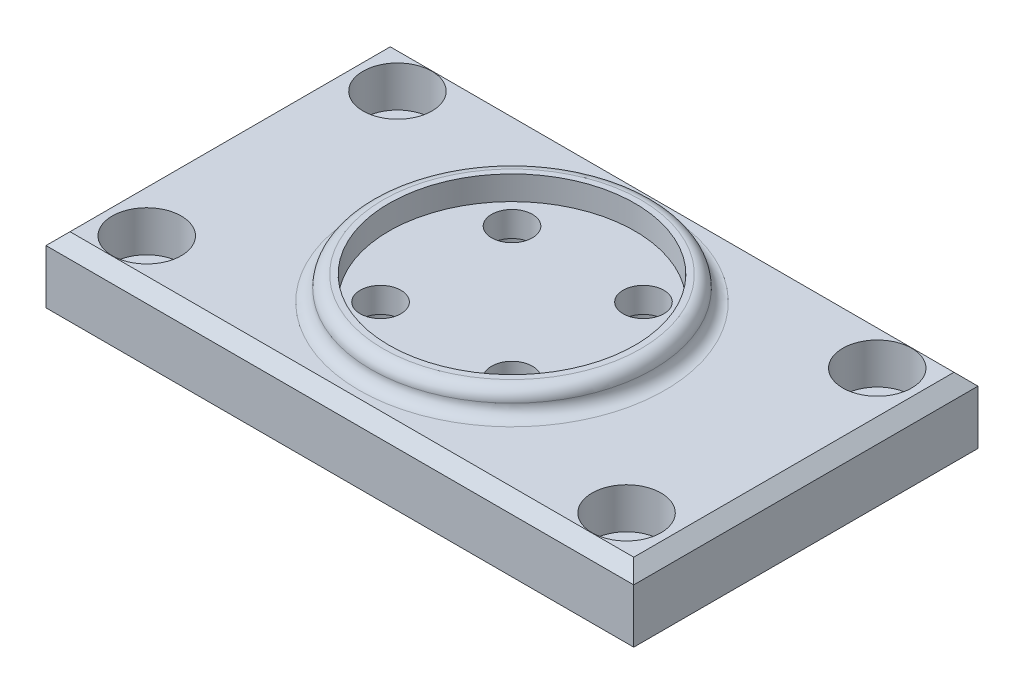
ISO-10303-21;
HEADER;
FILE_DESCRIPTION(('STEP AP214'),'2;1');
FILE_NAME('part.step','',(''),(''),'','','');
FILE_SCHEMA(('AUTOMOTIVE_DESIGN { 1 0 10303 214 1 1 1 1 }'));
ENDSEC;
DATA;
#1=APPLICATION_CONTEXT('core data for automotive mechanical design processes');
#2=APPLICATION_PROTOCOL_DEFINITION('international standard','automotive_design',2000,#1);
#3=PRODUCT_CONTEXT('',#1,'mechanical');
#4=PRODUCT('Part','Part','',(#3));
#5=PRODUCT_RELATED_PRODUCT_CATEGORY('part','',(#4));
#6=PRODUCT_DEFINITION_FORMATION('','',#4);
#7=PRODUCT_DEFINITION_CONTEXT('part definition',#1,'design');
#8=PRODUCT_DEFINITION('design','',#6,#7);
#9=PRODUCT_DEFINITION_SHAPE('','',#8);
#10=(LENGTH_UNIT() NAMED_UNIT(*) SI_UNIT(.MILLI.,.METRE.));
#11=(NAMED_UNIT(*) PLANE_ANGLE_UNIT() SI_UNIT($,.RADIAN.));
#12=(NAMED_UNIT(*) SI_UNIT($,.STERADIAN.) SOLID_ANGLE_UNIT());
#13=UNCERTAINTY_MEASURE_WITH_UNIT(LENGTH_MEASURE(1.E-05),#10,'distance_accuracy_value','');
#14=(GEOMETRIC_REPRESENTATION_CONTEXT(3) GLOBAL_UNCERTAINTY_ASSIGNED_CONTEXT((#13)) GLOBAL_UNIT_ASSIGNED_CONTEXT((#10,
#11,#12)) REPRESENTATION_CONTEXT('',''));
#15=CARTESIAN_POINT('',(0.,0.,0.));
#16=DIRECTION('',(0.,0.,1.));
#17=DIRECTION('',(1.,0.,0.));
#18=AXIS2_PLACEMENT_3D('',#15,#16,#17);
#19=CARTESIAN_POINT('',(0.,5.5,0.));
#20=DIRECTION('',(0.,1.,0.));
#21=DIRECTION('',(0.,0.,1.));
#22=AXIS2_PLACEMENT_3D('',#19,#20,#21);
#23=PLANE('',#22);
#24=CARTESIAN_POINT('',(5.48007755419574,5.5,-5.48007755419574));
#25=DIRECTION('',(0.,-1.,0.));
#26=DIRECTION('',(0.,0.,-1.));
#27=AXIS2_PLACEMENT_3D('',#24,#25,#26);
#28=CIRCLE('',#27,1.7);
#29=CARTESIAN_POINT('',(5.48007755419574,5.5,-7.18007755419574));
#30=VERTEX_POINT('',#29);
#31=EDGE_CURVE('E612',#30,#30,#28,.T.);
#32=ORIENTED_EDGE('',*,*,#31,.T.);
#33=EDGE_LOOP('',(#32));
#34=FACE_BOUND('',#33,.T.);
#35=CARTESIAN_POINT('',(-5.48007755419574,5.5,5.48007755419574));
#36=DIRECTION('',(0.,-1.,0.));
#37=DIRECTION('',(0.,0.,-1.));
#38=AXIS2_PLACEMENT_3D('',#35,#36,#37);
#39=CIRCLE('',#38,1.7);
#40=CARTESIAN_POINT('',(-5.48007755419574,5.5,3.78007755419574));
#41=VERTEX_POINT('',#40);
#42=EDGE_CURVE('E623',#41,#41,#39,.T.);
#43=ORIENTED_EDGE('',*,*,#42,.T.);
#44=EDGE_LOOP('',(#43));
#45=FACE_BOUND('',#44,.T.);
#46=CARTESIAN_POINT('',(-5.48007755419574,5.5,-5.48007755419575));
#47=DIRECTION('',(0.,-1.,0.));
#48=DIRECTION('',(0.,0.,-1.));
#49=AXIS2_PLACEMENT_3D('',#46,#47,#48);
#50=CIRCLE('',#49,1.7);
#51=CARTESIAN_POINT('',(-5.48007755419574,5.5,-7.18007755419575));
#52=VERTEX_POINT('',#51);
#53=EDGE_CURVE('E635',#52,#52,#50,.T.);
#54=ORIENTED_EDGE('',*,*,#53,.T.);
#55=EDGE_LOOP('',(#54));
#56=FACE_BOUND('',#55,.T.);
#57=CARTESIAN_POINT('',(5.48007755419574,5.5,5.48007755419574));
#58=DIRECTION('',(0.,-1.,0.));
#59=DIRECTION('',(0.,0.,-1.));
#60=AXIS2_PLACEMENT_3D('',#57,#58,#59);
#61=CIRCLE('',#60,1.7);
#62=CARTESIAN_POINT('',(5.48007755419574,5.5,3.78007755419575));
#63=VERTEX_POINT('',#62);
#64=EDGE_CURVE('E647',#63,#63,#61,.T.);
#65=ORIENTED_EDGE('',*,*,#64,.T.);
#66=EDGE_LOOP('',(#65));
#67=FACE_BOUND('',#66,.T.);
#68=CARTESIAN_POINT('',(0.,5.5,0.));
#69=DIRECTION('',(0.,1.,0.));
#70=DIRECTION('',(0.,0.,1.));
#71=AXIS2_PLACEMENT_3D('',#68,#69,#70);
#72=CIRCLE('',#71,10.25);
#73=CARTESIAN_POINT('',(0.,5.5,10.25));
#74=VERTEX_POINT('',#73);
#75=EDGE_CURVE('E137',#74,#74,#72,.T.);
#76=ORIENTED_EDGE('',*,*,#75,.T.);
#77=EDGE_LOOP('',(#76));
#78=FACE_BOUND('',#77,.T.);
#79=ADVANCED_FACE('F41',(#34,#45,#56,#67,#78),#23,.T.);
#80=CARTESIAN_POINT('',(0.,0.,0.));
#81=DIRECTION('',(0.,1.,0.));
#82=DIRECTION('',(0.,0.,1.));
#83=AXIS2_PLACEMENT_3D('',#80,#81,#82);
#84=PLANE('',#83);
#85=CARTESIAN_POINT('',(5.48007755419574,0.,5.48007755419574));
#86=DIRECTION('',(0.,-1.,0.));
#87=DIRECTION('',(0.,0.,-1.));
#88=AXIS2_PLACEMENT_3D('',#85,#86,#87);
#89=CIRCLE('',#88,2.87499999999999);
#90=CARTESIAN_POINT('',(5.48007755419574,0.,2.60507755419575));
#91=VERTEX_POINT('',#90);
#92=EDGE_CURVE('E656',#91,#91,#89,.T.);
#93=ORIENTED_EDGE('',*,*,#92,.F.);
#94=EDGE_LOOP('',(#93));
#95=FACE_BOUND('',#94,.T.);
#96=CARTESIAN_POINT('',(-5.48007755419574,0.,-5.48007755419575));
#97=DIRECTION('',(0.,-1.,0.));
#98=DIRECTION('',(0.,0.,-1.));
#99=AXIS2_PLACEMENT_3D('',#96,#97,#98);
#100=CIRCLE('',#99,2.875);
#101=CARTESIAN_POINT('',(-5.48007755419574,0.,-8.35507755419574));
#102=VERTEX_POINT('',#101);
#103=EDGE_CURVE('E644',#102,#102,#100,.T.);
#104=ORIENTED_EDGE('',*,*,#103,.F.);
#105=EDGE_LOOP('',(#104));
#106=FACE_BOUND('',#105,.T.);
#107=CARTESIAN_POINT('',(-5.48007755419574,0.,5.48007755419574));
#108=DIRECTION('',(0.,-1.,0.));
#109=DIRECTION('',(0.,0.,-1.));
#110=AXIS2_PLACEMENT_3D('',#107,#108,#109);
#111=CIRCLE('',#110,2.875);
#112=CARTESIAN_POINT('',(-5.48007755419574,0.,2.60507755419575));
#113=VERTEX_POINT('',#112);
#114=EDGE_CURVE('E632',#113,#113,#111,.T.);
#115=ORIENTED_EDGE('',*,*,#114,.F.);
#116=EDGE_LOOP('',(#115));
#117=FACE_BOUND('',#116,.T.);
#118=CARTESIAN_POINT('',(-20.,0.,-10.45));
#119=DIRECTION('',(0.,1.,0.));
#120=DIRECTION('',(0.,0.,1.));
#121=AXIS2_PLACEMENT_3D('',#118,#119,#120);
#122=CIRCLE('',#121,1.7);
#123=CARTESIAN_POINT('',(-20.,0.,-8.75));
#124=VERTEX_POINT('',#123);
#125=EDGE_CURVE('E602',#124,#124,#122,.T.);
#126=ORIENTED_EDGE('',*,*,#125,.T.);
#127=EDGE_LOOP('',(#126));
#128=FACE_BOUND('',#127,.T.);
#129=CARTESIAN_POINT('',(20.,0.,10.45));
#130=DIRECTION('',(0.,1.,0.));
#131=DIRECTION('',(0.,0.,1.));
#132=AXIS2_PLACEMENT_3D('',#129,#130,#131);
#133=CIRCLE('',#132,1.7);
#134=CARTESIAN_POINT('',(20.,0.,12.15));
#135=VERTEX_POINT('',#134);
#136=EDGE_CURVE('E590',#135,#135,#133,.T.);
#137=ORIENTED_EDGE('',*,*,#136,.T.);
#138=EDGE_LOOP('',(#137));
#139=FACE_BOUND('',#138,.T.);
#140=CARTESIAN_POINT('',(20.,0.,-10.45));
#141=DIRECTION('',(0.,1.,0.));
#142=DIRECTION('',(0.,0.,1.));
#143=AXIS2_PLACEMENT_3D('',#140,#141,#142);
#144=CIRCLE('',#143,1.7);
#145=CARTESIAN_POINT('',(20.,0.,-8.75));
#146=VERTEX_POINT('',#145);
#147=EDGE_CURVE('E205',#146,#146,#144,.T.);
#148=ORIENTED_EDGE('',*,*,#147,.T.);
#149=EDGE_LOOP('',(#148));
#150=FACE_BOUND('',#149,.T.);
#151=CARTESIAN_POINT('',(-20.,0.,10.45));
#152=DIRECTION('',(0.,1.,0.));
#153=DIRECTION('',(0.,0.,1.));
#154=AXIS2_PLACEMENT_3D('',#151,#152,#153);
#155=CIRCLE('',#154,1.7);
#156=CARTESIAN_POINT('',(-20.,0.,12.15));
#157=VERTEX_POINT('',#156);
#158=EDGE_CURVE('E114',#157,#157,#155,.T.);
#159=ORIENTED_EDGE('',*,*,#158,.T.);
#160=EDGE_LOOP('',(#159));
#161=FACE_BOUND('',#160,.T.);
#162=DIRECTION('',(0.,0.,1.));
#163=VECTOR('',#162,1.);
#164=CARTESIAN_POINT('',(-24.5,0.,14.35));
#165=LINE('',#164,#163);
#166=CARTESIAN_POINT('',(-24.5,0.,-14.35));
#167=VERTEX_POINT('',#166);
#168=CARTESIAN_POINT('',(-24.5,0.,14.35));
#169=VERTEX_POINT('',#168);
#170=EDGE_CURVE('E107',#167,#169,#165,.T.);
#171=ORIENTED_EDGE('',*,*,#170,.F.);
#172=DIRECTION('',(-1.,0.,0.));
#173=VECTOR('',#172,1.);
#174=CARTESIAN_POINT('',(24.5,0.,-14.35));
#175=LINE('',#174,#173);
#176=CARTESIAN_POINT('',(24.5,0.,-14.35));
#177=VERTEX_POINT('',#176);
#178=EDGE_CURVE('E122',#177,#167,#175,.T.);
#179=ORIENTED_EDGE('',*,*,#178,.F.);
#180=DIRECTION('',(0.,0.,-1.));
#181=VECTOR('',#180,1.);
#182=CARTESIAN_POINT('',(24.5,0.,14.35));
#183=LINE('',#182,#181);
#184=CARTESIAN_POINT('',(24.5,0.,14.35));
#185=VERTEX_POINT('',#184);
#186=EDGE_CURVE('E109',#185,#177,#183,.T.);
#187=ORIENTED_EDGE('',*,*,#186,.F.);
#188=DIRECTION('',(1.,0.,0.));
#189=VECTOR('',#188,1.);
#190=CARTESIAN_POINT('',(24.5,0.,14.35));
#191=LINE('',#190,#189);
#192=EDGE_CURVE('E96',#169,#185,#191,.T.);
#193=ORIENTED_EDGE('',*,*,#192,.F.);
#194=EDGE_LOOP('',(#171,#179,#187,#193));
#195=FACE_BOUND('',#194,.T.);
#196=CARTESIAN_POINT('',(5.48007755419574,0.,-5.48007755419574));
#197=DIRECTION('',(0.,-1.,0.));
#198=DIRECTION('',(0.,0.,-1.));
#199=AXIS2_PLACEMENT_3D('',#196,#197,#198);
#200=CIRCLE('',#199,2.875);
#201=CARTESIAN_POINT('',(5.48007755419574,0.,-8.35507755419574));
#202=VERTEX_POINT('',#201);
#203=EDGE_CURVE('E620',#202,#202,#200,.T.);
#204=ORIENTED_EDGE('',*,*,#203,.F.);
#205=EDGE_LOOP('',(#204));
#206=FACE_BOUND('',#205,.T.);
#207=ADVANCED_FACE('F104',(#95,#106,#117,#128,#139,#150,#161,#195,#206),#84,.F.);
#208=CARTESIAN_POINT('',(-24.5,5.5,14.35));
#209=DIRECTION('',(1.,0.,0.));
#210=DIRECTION('',(0.,0.,-1.));
#211=AXIS2_PLACEMENT_3D('',#208,#209,#210);
#212=PLANE('',#211);
#213=DIRECTION('',(0.,-1.,0.));
#214=VECTOR('',#213,1.);
#215=CARTESIAN_POINT('',(-24.5,5.5,14.35));
#216=LINE('',#215,#214);
#217=CARTESIAN_POINT('',(-24.5,4.49999999999999,14.35));
#218=VERTEX_POINT('',#217);
#219=EDGE_CURVE('E93',#218,#169,#216,.T.);
#220=ORIENTED_EDGE('',*,*,#219,.F.);
#221=DIRECTION('',(0.,0.,-1.));
#222=VECTOR('',#221,1.);
#223=CARTESIAN_POINT('',(-24.5,4.49999999999999,-14.35));
#224=LINE('',#223,#222);
#225=CARTESIAN_POINT('',(-24.5,4.49999999999999,-14.35));
#226=VERTEX_POINT('',#225);
#227=EDGE_CURVE('E51',#218,#226,#224,.T.);
#228=ORIENTED_EDGE('',*,*,#227,.T.);
#229=DIRECTION('',(0.,-1.,0.));
#230=VECTOR('',#229,1.);
#231=CARTESIAN_POINT('',(-24.5,5.5,-14.35));
#232=LINE('',#231,#230);
#233=EDGE_CURVE('E112',#226,#167,#232,.T.);
#234=ORIENTED_EDGE('',*,*,#233,.T.);
#235=ORIENTED_EDGE('',*,*,#170,.T.);
#236=EDGE_LOOP('',(#220,#228,#234,#235));
#237=FACE_BOUND('',#236,.T.);
#238=ADVANCED_FACE('F111',(#237),#212,.F.);
#239=CARTESIAN_POINT('',(24.5,5.5,14.35));
#240=DIRECTION('',(0.,0.,-1.));
#241=DIRECTION('',(-1.,0.,0.));
#242=AXIS2_PLACEMENT_3D('',#239,#240,#241);
#243=PLANE('',#242);
#244=DIRECTION('',(0.,-1.,0.));
#245=VECTOR('',#244,1.);
#246=CARTESIAN_POINT('',(24.5,5.5,14.35));
#247=LINE('',#246,#245);
#248=CARTESIAN_POINT('',(24.5,4.49999999999999,14.35));
#249=VERTEX_POINT('',#248);
#250=EDGE_CURVE('E100',#249,#185,#247,.T.);
#251=ORIENTED_EDGE('',*,*,#250,.F.);
#252=DIRECTION('',(-1.,0.,0.));
#253=VECTOR('',#252,1.);
#254=CARTESIAN_POINT('',(-24.5,4.49999999999999,14.35));
#255=LINE('',#254,#253);
#256=EDGE_CURVE('E11',#249,#218,#255,.T.);
#257=ORIENTED_EDGE('',*,*,#256,.T.);
#258=ORIENTED_EDGE('',*,*,#219,.T.);
#259=ORIENTED_EDGE('',*,*,#192,.T.);
#260=EDGE_LOOP('',(#251,#257,#258,#259));
#261=FACE_BOUND('',#260,.T.);
#262=ADVANCED_FACE('F95',(#261),#243,.F.);
#263=CARTESIAN_POINT('',(24.5,5.5,14.35));
#264=DIRECTION('',(-1.,0.,0.));
#265=DIRECTION('',(0.,0.,1.));
#266=AXIS2_PLACEMENT_3D('',#263,#264,#265);
#267=PLANE('',#266);
#268=DIRECTION('',(0.,-1.,0.));
#269=VECTOR('',#268,1.);
#270=CARTESIAN_POINT('',(24.5,5.5,-14.35));
#271=LINE('',#270,#269);
#272=CARTESIAN_POINT('',(24.5,4.49999999999999,-14.35));
#273=VERTEX_POINT('',#272);
#274=EDGE_CURVE('E125',#273,#177,#271,.T.);
#275=ORIENTED_EDGE('',*,*,#274,.F.);
#276=DIRECTION('',(0.,0.,1.));
#277=VECTOR('',#276,1.);
#278=CARTESIAN_POINT('',(24.5,4.49999999999999,14.35));
#279=LINE('',#278,#277);
#280=EDGE_CURVE('E146',#273,#249,#279,.T.);
#281=ORIENTED_EDGE('',*,*,#280,.T.);
#282=ORIENTED_EDGE('',*,*,#250,.T.);
#283=ORIENTED_EDGE('',*,*,#186,.T.);
#284=EDGE_LOOP('',(#275,#281,#282,#283));
#285=FACE_BOUND('',#284,.T.);
#286=ADVANCED_FACE('F176',(#285),#267,.F.);
#287=CARTESIAN_POINT('',(24.5,5.5,-14.35));
#288=DIRECTION('',(0.,0.,1.));
#289=DIRECTION('',(1.,0.,0.));
#290=AXIS2_PLACEMENT_3D('',#287,#288,#289);
#291=PLANE('',#290);
#292=ORIENTED_EDGE('',*,*,#233,.F.);
#293=DIRECTION('',(1.,0.,0.));
#294=VECTOR('',#293,1.);
#295=CARTESIAN_POINT('',(24.5,4.49999999999999,-14.35));
#296=LINE('',#295,#294);
#297=EDGE_CURVE('E149',#226,#273,#296,.T.);
#298=ORIENTED_EDGE('',*,*,#297,.T.);
#299=ORIENTED_EDGE('',*,*,#274,.T.);
#300=ORIENTED_EDGE('',*,*,#178,.T.);
#301=EDGE_LOOP('',(#292,#298,#299,#300));
#302=FACE_BOUND('',#301,.T.);
#303=ADVANCED_FACE('F173',(#302),#291,.F.);
#304=DIRECTION('',(1.,0.,0.));
#305=VECTOR('',#304,1.);
#306=CARTESIAN_POINT('',(24.5,5.5,13.35));
#307=LINE('',#306,#305);
#308=CARTESIAN_POINT('',(-23.5,5.5,13.35));
#309=VERTEX_POINT('',#308);
#310=CARTESIAN_POINT('',(23.5,5.5,13.35));
#311=VERTEX_POINT('',#310);
#312=EDGE_CURVE('E133',#309,#311,#307,.T.);
#313=ORIENTED_EDGE('',*,*,#312,.T.);
#314=DIRECTION('',(0.,0.,-1.));
#315=VECTOR('',#314,1.);
#316=CARTESIAN_POINT('',(23.5,5.5,-14.35));
#317=LINE('',#316,#315);
#318=CARTESIAN_POINT('',(23.5,5.5,-13.35));
#319=VERTEX_POINT('',#318);
#320=EDGE_CURVE('E143',#311,#319,#317,.T.);
#321=ORIENTED_EDGE('',*,*,#320,.T.);
#322=DIRECTION('',(-1.,0.,0.));
#323=VECTOR('',#322,1.);
#324=CARTESIAN_POINT('',(-24.5,5.5,-13.35));
#325=LINE('',#324,#323);
#326=CARTESIAN_POINT('',(-23.5,5.5,-13.35));
#327=VERTEX_POINT('',#326);
#328=EDGE_CURVE('E141',#319,#327,#325,.T.);
#329=ORIENTED_EDGE('',*,*,#328,.T.);
#330=DIRECTION('',(0.,0.,1.));
#331=VECTOR('',#330,1.);
#332=CARTESIAN_POINT('',(-23.5,5.5,14.35));
#333=LINE('',#332,#331);
#334=EDGE_CURVE('E139',#327,#309,#333,.T.);
#335=ORIENTED_EDGE('',*,*,#334,.T.);
#336=EDGE_LOOP('',(#313,#321,#329,#335));
#337=FACE_BOUND('',#336,.T.);
#338=CARTESIAN_POINT('',(0.,5.5,0.));
#339=DIRECTION('',(0.,1.,0.));
#340=DIRECTION('',(0.,0.,1.));
#341=AXIS2_PLACEMENT_3D('',#338,#339,#340);
#342=CIRCLE('',#341,12.75);
#343=CARTESIAN_POINT('',(0.,5.5,12.75));
#344=VERTEX_POINT('',#343);
#345=EDGE_CURVE('E130',#344,#344,#342,.F.);
#346=ORIENTED_EDGE('',*,*,#345,.T.);
#347=EDGE_LOOP('',(#346));
#348=FACE_BOUND('',#347,.T.);
#349=CARTESIAN_POINT('',(-20.,5.5,-10.45));
#350=DIRECTION('',(0.,1.,0.));
#351=DIRECTION('',(0.,0.,1.));
#352=AXIS2_PLACEMENT_3D('',#349,#350,#351);
#353=CIRCLE('',#352,2.875);
#354=CARTESIAN_POINT('',(-20.,5.5,-7.575));
#355=VERTEX_POINT('',#354);
#356=EDGE_CURVE('E191',#355,#355,#353,.T.);
#357=ORIENTED_EDGE('',*,*,#356,.F.);
#358=EDGE_LOOP('',(#357));
#359=FACE_BOUND('',#358,.T.);
#360=CARTESIAN_POINT('',(20.,5.5,10.45));
#361=DIRECTION('',(0.,1.,0.));
#362=DIRECTION('',(0.,0.,1.));
#363=AXIS2_PLACEMENT_3D('',#360,#361,#362);
#364=CIRCLE('',#363,2.875);
#365=CARTESIAN_POINT('',(20.,5.5,13.325));
#366=VERTEX_POINT('',#365);
#367=EDGE_CURVE('E195',#366,#366,#364,.T.);
#368=ORIENTED_EDGE('',*,*,#367,.F.);
#369=EDGE_LOOP('',(#368));
#370=FACE_BOUND('',#369,.T.);
#371=CARTESIAN_POINT('',(20.,5.5,-10.45));
#372=DIRECTION('',(0.,1.,0.));
#373=DIRECTION('',(0.,0.,1.));
#374=AXIS2_PLACEMENT_3D('',#371,#372,#373);
#375=CIRCLE('',#374,2.875);
#376=CARTESIAN_POINT('',(20.,5.5,-7.575));
#377=VERTEX_POINT('',#376);
#378=EDGE_CURVE('E199',#377,#377,#375,.T.);
#379=ORIENTED_EDGE('',*,*,#378,.F.);
#380=EDGE_LOOP('',(#379));
#381=FACE_BOUND('',#380,.T.);
#382=CARTESIAN_POINT('',(-20.,5.5,10.45));
#383=DIRECTION('',(0.,1.,0.));
#384=DIRECTION('',(0.,0.,1.));
#385=AXIS2_PLACEMENT_3D('',#382,#383,#384);
#386=CIRCLE('',#385,2.875);
#387=CARTESIAN_POINT('',(-20.,5.5,13.325));
#388=VERTEX_POINT('',#387);
#389=EDGE_CURVE('E202',#388,#388,#386,.T.);
#390=ORIENTED_EDGE('',*,*,#389,.F.);
#391=EDGE_LOOP('',(#390));
#392=FACE_BOUND('',#391,.T.);
#393=ADVANCED_FACE('F181',(#337,#348,#359,#370,#381,#392),#23,.T.);
#394=CARTESIAN_POINT('',(-20.,5.5,10.45));
#395=DIRECTION('',(0.,1.,0.));
#396=DIRECTION('',(0.,0.,1.));
#397=AXIS2_PLACEMENT_3D('',#394,#395,#396);
#398=CYLINDRICAL_SURFACE('',#397,1.7);
#399=ORIENTED_EDGE('',*,*,#158,.F.);
#400=EDGE_LOOP('',(#399));
#401=FACE_BOUND('',#400,.T.);
#402=CARTESIAN_POINT('',(-20.,2.1,10.45));
#403=DIRECTION('',(0.,1.,0.));
#404=DIRECTION('',(0.,0.,1.));
#405=AXIS2_PLACEMENT_3D('',#402,#403,#404);
#406=CIRCLE('',#405,1.7);
#407=CARTESIAN_POINT('',(-20.,2.1,12.15));
#408=VERTEX_POINT('',#407);
#409=EDGE_CURVE('E117',#408,#408,#406,.T.);
#410=ORIENTED_EDGE('',*,*,#409,.T.);
#411=EDGE_LOOP('',(#410));
#412=FACE_BOUND('',#411,.T.);
#413=ADVANCED_FACE('F184',(#401,#412),#398,.F.);
#414=CARTESIAN_POINT('',(-18.3,2.1,10.45));
#415=DIRECTION('',(0.,-1.,0.));
#416=DIRECTION('',(0.,0.,-1.));
#417=AXIS2_PLACEMENT_3D('',#414,#415,#416);
#418=PLANE('',#417);
#419=ORIENTED_EDGE('',*,*,#409,.F.);
#420=EDGE_LOOP('',(#419));
#421=FACE_BOUND('',#420,.T.);
#422=CARTESIAN_POINT('',(-20.,2.1,10.45));
#423=DIRECTION('',(0.,1.,0.));
#424=DIRECTION('',(0.,0.,1.));
#425=AXIS2_PLACEMENT_3D('',#422,#423,#424);
#426=CIRCLE('',#425,2.875);
#427=CARTESIAN_POINT('',(-20.,2.1,13.325));
#428=VERTEX_POINT('',#427);
#429=EDGE_CURVE('E204',#428,#428,#426,.T.);
#430=ORIENTED_EDGE('',*,*,#429,.T.);
#431=EDGE_LOOP('',(#430));
#432=FACE_BOUND('',#431,.T.);
#433=ADVANCED_FACE('F217',(#421,#432),#418,.F.);
#434=CARTESIAN_POINT('',(-20.,5.5,10.45));
#435=DIRECTION('',(0.,1.,0.));
#436=DIRECTION('',(0.,0.,1.));
#437=AXIS2_PLACEMENT_3D('',#434,#435,#436);
#438=CYLINDRICAL_SURFACE('',#437,2.875);
#439=ORIENTED_EDGE('',*,*,#429,.F.);
#440=EDGE_LOOP('',(#439));
#441=FACE_BOUND('',#440,.T.);
#442=ORIENTED_EDGE('',*,*,#389,.T.);
#443=EDGE_LOOP('',(#442));
#444=FACE_BOUND('',#443,.T.);
#445=ADVANCED_FACE('F220',(#441,#444),#438,.F.);
#446=CARTESIAN_POINT('',(20.,5.5,-10.45));
#447=DIRECTION('',(0.,1.,0.));
#448=DIRECTION('',(0.,0.,1.));
#449=AXIS2_PLACEMENT_3D('',#446,#447,#448);
#450=CYLINDRICAL_SURFACE('',#449,1.7);
#451=ORIENTED_EDGE('',*,*,#147,.F.);
#452=EDGE_LOOP('',(#451));
#453=FACE_BOUND('',#452,.T.);
#454=CARTESIAN_POINT('',(20.,2.1,-10.45));
#455=DIRECTION('',(0.,1.,0.));
#456=DIRECTION('',(0.,0.,1.));
#457=AXIS2_PLACEMENT_3D('',#454,#455,#456);
#458=CIRCLE('',#457,1.7);
#459=CARTESIAN_POINT('',(20.,2.1,-8.75));
#460=VERTEX_POINT('',#459);
#461=EDGE_CURVE('E210',#460,#460,#458,.T.);
#462=ORIENTED_EDGE('',*,*,#461,.T.);
#463=EDGE_LOOP('',(#462));
#464=FACE_BOUND('',#463,.T.);
#465=ADVANCED_FACE('F225',(#453,#464),#450,.F.);
#466=CARTESIAN_POINT('',(21.7,2.1,-10.45));
#467=DIRECTION('',(0.,-1.,0.));
#468=DIRECTION('',(0.,0.,-1.));
#469=AXIS2_PLACEMENT_3D('',#466,#467,#468);
#470=PLANE('',#469);
#471=ORIENTED_EDGE('',*,*,#461,.F.);
#472=EDGE_LOOP('',(#471));
#473=FACE_BOUND('',#472,.T.);
#474=CARTESIAN_POINT('',(20.,2.1,-10.45));
#475=DIRECTION('',(0.,1.,0.));
#476=DIRECTION('',(0.,0.,1.));
#477=AXIS2_PLACEMENT_3D('',#474,#475,#476);
#478=CIRCLE('',#477,2.875);
#479=CARTESIAN_POINT('',(20.,2.1,-7.575));
#480=VERTEX_POINT('',#479);
#481=EDGE_CURVE('E588',#480,#480,#478,.T.);
#482=ORIENTED_EDGE('',*,*,#481,.T.);
#483=EDGE_LOOP('',(#482));
#484=FACE_BOUND('',#483,.T.);
#485=ADVANCED_FACE('F230',(#473,#484),#470,.F.);
#486=CARTESIAN_POINT('',(20.,5.5,-10.45));
#487=DIRECTION('',(0.,1.,0.));
#488=DIRECTION('',(0.,0.,1.));
#489=AXIS2_PLACEMENT_3D('',#486,#487,#488);
#490=CYLINDRICAL_SURFACE('',#489,2.875);
#491=ORIENTED_EDGE('',*,*,#481,.F.);
#492=EDGE_LOOP('',(#491));
#493=FACE_BOUND('',#492,.T.);
#494=ORIENTED_EDGE('',*,*,#378,.T.);
#495=EDGE_LOOP('',(#494));
#496=FACE_BOUND('',#495,.T.);
#497=ADVANCED_FACE('F525',(#493,#496),#490,.F.);
#498=CARTESIAN_POINT('',(20.,5.5,10.45));
#499=DIRECTION('',(0.,1.,0.));
#500=DIRECTION('',(0.,0.,1.));
#501=AXIS2_PLACEMENT_3D('',#498,#499,#500);
#502=CYLINDRICAL_SURFACE('',#501,1.7);
#503=ORIENTED_EDGE('',*,*,#136,.F.);
#504=EDGE_LOOP('',(#503));
#505=FACE_BOUND('',#504,.T.);
#506=CARTESIAN_POINT('',(20.,2.1,10.45));
#507=DIRECTION('',(0.,1.,0.));
#508=DIRECTION('',(0.,0.,1.));
#509=AXIS2_PLACEMENT_3D('',#506,#507,#508);
#510=CIRCLE('',#509,1.7);
#511=CARTESIAN_POINT('',(20.,2.1,12.15));
#512=VERTEX_POINT('',#511);
#513=EDGE_CURVE('E595',#512,#512,#510,.T.);
#514=ORIENTED_EDGE('',*,*,#513,.T.);
#515=EDGE_LOOP('',(#514));
#516=FACE_BOUND('',#515,.T.);
#517=ADVANCED_FACE('F516',(#505,#516),#502,.F.);
#518=CARTESIAN_POINT('',(21.7,2.1,10.45));
#519=DIRECTION('',(0.,-1.,0.));
#520=DIRECTION('',(0.,0.,-1.));
#521=AXIS2_PLACEMENT_3D('',#518,#519,#520);
#522=PLANE('',#521);
#523=ORIENTED_EDGE('',*,*,#513,.F.);
#524=EDGE_LOOP('',(#523));
#525=FACE_BOUND('',#524,.T.);
#526=CARTESIAN_POINT('',(20.,2.1,10.45));
#527=DIRECTION('',(0.,1.,0.));
#528=DIRECTION('',(0.,0.,1.));
#529=AXIS2_PLACEMENT_3D('',#526,#527,#528);
#530=CIRCLE('',#529,2.875);
#531=CARTESIAN_POINT('',(20.,2.1,13.325));
#532=VERTEX_POINT('',#531);
#533=EDGE_CURVE('E598',#532,#532,#530,.T.);
#534=ORIENTED_EDGE('',*,*,#533,.T.);
#535=EDGE_LOOP('',(#534));
#536=FACE_BOUND('',#535,.T.);
#537=ADVANCED_FACE('F507',(#525,#536),#522,.F.);
#538=CARTESIAN_POINT('',(20.,5.5,10.45));
#539=DIRECTION('',(0.,1.,0.));
#540=DIRECTION('',(0.,0.,1.));
#541=AXIS2_PLACEMENT_3D('',#538,#539,#540);
#542=CYLINDRICAL_SURFACE('',#541,2.875);
#543=ORIENTED_EDGE('',*,*,#533,.F.);
#544=EDGE_LOOP('',(#543));
#545=FACE_BOUND('',#544,.T.);
#546=ORIENTED_EDGE('',*,*,#367,.T.);
#547=EDGE_LOOP('',(#546));
#548=FACE_BOUND('',#547,.T.);
#549=ADVANCED_FACE('F498',(#545,#548),#542,.F.);
#550=CARTESIAN_POINT('',(-20.,5.5,-10.45));
#551=DIRECTION('',(0.,1.,0.));
#552=DIRECTION('',(0.,0.,1.));
#553=AXIS2_PLACEMENT_3D('',#550,#551,#552);
#554=CYLINDRICAL_SURFACE('',#553,1.7);
#555=ORIENTED_EDGE('',*,*,#125,.F.);
#556=EDGE_LOOP('',(#555));
#557=FACE_BOUND('',#556,.T.);
#558=CARTESIAN_POINT('',(-20.,2.1,-10.45));
#559=DIRECTION('',(0.,1.,0.));
#560=DIRECTION('',(0.,0.,1.));
#561=AXIS2_PLACEMENT_3D('',#558,#559,#560);
#562=CIRCLE('',#561,1.7);
#563=CARTESIAN_POINT('',(-20.,2.1,-8.75));
#564=VERTEX_POINT('',#563);
#565=EDGE_CURVE('E605',#564,#564,#562,.T.);
#566=ORIENTED_EDGE('',*,*,#565,.T.);
#567=EDGE_LOOP('',(#566));
#568=FACE_BOUND('',#567,.T.);
#569=ADVANCED_FACE('F489',(#557,#568),#554,.F.);
#570=CARTESIAN_POINT('',(-18.3,2.1,-10.45));
#571=DIRECTION('',(0.,-1.,0.));
#572=DIRECTION('',(0.,0.,-1.));
#573=AXIS2_PLACEMENT_3D('',#570,#571,#572);
#574=PLANE('',#573);
#575=ORIENTED_EDGE('',*,*,#565,.F.);
#576=EDGE_LOOP('',(#575));
#577=FACE_BOUND('',#576,.T.);
#578=CARTESIAN_POINT('',(-20.,2.1,-10.45));
#579=DIRECTION('',(0.,1.,0.));
#580=DIRECTION('',(0.,0.,1.));
#581=AXIS2_PLACEMENT_3D('',#578,#579,#580);
#582=CIRCLE('',#581,2.875);
#583=CARTESIAN_POINT('',(-20.,2.1,-7.575));
#584=VERTEX_POINT('',#583);
#585=EDGE_CURVE('E608',#584,#584,#582,.T.);
#586=ORIENTED_EDGE('',*,*,#585,.T.);
#587=EDGE_LOOP('',(#586));
#588=FACE_BOUND('',#587,.T.);
#589=ADVANCED_FACE('F480',(#577,#588),#574,.F.);
#590=CARTESIAN_POINT('',(-20.,5.5,-10.45));
#591=DIRECTION('',(0.,1.,0.));
#592=DIRECTION('',(0.,0.,1.));
#593=AXIS2_PLACEMENT_3D('',#590,#591,#592);
#594=CYLINDRICAL_SURFACE('',#593,2.875);
#595=ORIENTED_EDGE('',*,*,#585,.F.);
#596=EDGE_LOOP('',(#595));
#597=FACE_BOUND('',#596,.T.);
#598=ORIENTED_EDGE('',*,*,#356,.T.);
#599=EDGE_LOOP('',(#598));
#600=FACE_BOUND('',#599,.T.);
#601=ADVANCED_FACE('F465',(#597,#600),#594,.F.);
#602=CARTESIAN_POINT('',(5.48007755419574,0.,-5.48007755419574));
#603=DIRECTION('',(0.,-1.,0.));
#604=DIRECTION('',(0.,0.,-1.));
#605=AXIS2_PLACEMENT_3D('',#602,#603,#604);
#606=CYLINDRICAL_SURFACE('',#605,1.70000000000001);
#607=ORIENTED_EDGE('',*,*,#31,.F.);
#608=EDGE_LOOP('',(#607));
#609=FACE_BOUND('',#608,.T.);
#610=CARTESIAN_POINT('',(5.48007755419574,3.4,-5.48007755419574));
#611=DIRECTION('',(0.,-1.,0.));
#612=DIRECTION('',(0.,0.,-1.));
#613=AXIS2_PLACEMENT_3D('',#610,#611,#612);
#614=CIRCLE('',#613,1.70000000000001);
#615=CARTESIAN_POINT('',(5.48007755419574,3.4,-7.18007755419576));
#616=VERTEX_POINT('',#615);
#617=EDGE_CURVE('E614',#616,#616,#614,.T.);
#618=ORIENTED_EDGE('',*,*,#617,.T.);
#619=EDGE_LOOP('',(#618));
#620=FACE_BOUND('',#619,.T.);
#621=ADVANCED_FACE('F456',(#609,#620),#606,.F.);
#622=CARTESIAN_POINT('',(7.18007755419576,3.4,-5.48007755419574));
#623=DIRECTION('',(0.,1.,0.));
#624=DIRECTION('',(0.,0.,1.));
#625=AXIS2_PLACEMENT_3D('',#622,#623,#624);
#626=PLANE('',#625);
#627=ORIENTED_EDGE('',*,*,#617,.F.);
#628=EDGE_LOOP('',(#627));
#629=FACE_BOUND('',#628,.T.);
#630=CARTESIAN_POINT('',(5.48007755419574,3.4,-5.48007755419574));
#631=DIRECTION('',(0.,-1.,0.));
#632=DIRECTION('',(0.,0.,-1.));
#633=AXIS2_PLACEMENT_3D('',#630,#631,#632);
#634=CIRCLE('',#633,2.875);
#635=CARTESIAN_POINT('',(5.48007755419574,3.4,-8.35507755419574));
#636=VERTEX_POINT('',#635);
#637=EDGE_CURVE('E617',#636,#636,#634,.T.);
#638=ORIENTED_EDGE('',*,*,#637,.T.);
#639=EDGE_LOOP('',(#638));
#640=FACE_BOUND('',#639,.T.);
#641=ADVANCED_FACE('F447',(#629,#640),#626,.F.);
#642=CARTESIAN_POINT('',(5.48007755419574,0.,-5.48007755419574));
#643=DIRECTION('',(0.,-1.,0.));
#644=DIRECTION('',(0.,0.,-1.));
#645=AXIS2_PLACEMENT_3D('',#642,#643,#644);
#646=CYLINDRICAL_SURFACE('',#645,2.875);
#647=ORIENTED_EDGE('',*,*,#637,.F.);
#648=EDGE_LOOP('',(#647));
#649=FACE_BOUND('',#648,.T.);
#650=ORIENTED_EDGE('',*,*,#203,.T.);
#651=EDGE_LOOP('',(#650));
#652=FACE_BOUND('',#651,.T.);
#653=ADVANCED_FACE('F438',(#649,#652),#646,.F.);
#654=CARTESIAN_POINT('',(-5.48007755419574,0.,5.48007755419574));
#655=DIRECTION('',(0.,-1.,0.));
#656=DIRECTION('',(0.,0.,-1.));
#657=AXIS2_PLACEMENT_3D('',#654,#655,#656);
#658=CYLINDRICAL_SURFACE('',#657,1.70000000000001);
#659=ORIENTED_EDGE('',*,*,#42,.F.);
#660=EDGE_LOOP('',(#659));
#661=FACE_BOUND('',#660,.T.);
#662=CARTESIAN_POINT('',(-5.48007755419574,3.4,5.48007755419574));
#663=DIRECTION('',(0.,-1.,0.));
#664=DIRECTION('',(0.,0.,-1.));
#665=AXIS2_PLACEMENT_3D('',#662,#663,#664);
#666=CIRCLE('',#665,1.70000000000001);
#667=CARTESIAN_POINT('',(-5.48007755419574,3.4,3.78007755419573));
#668=VERTEX_POINT('',#667);
#669=EDGE_CURVE('E626',#668,#668,#666,.T.);
#670=ORIENTED_EDGE('',*,*,#669,.T.);
#671=EDGE_LOOP('',(#670));
#672=FACE_BOUND('',#671,.T.);
#673=ADVANCED_FACE('F429',(#661,#672),#658,.F.);
#674=CARTESIAN_POINT('',(-3.78007755419573,3.4,5.48007755419574));
#675=DIRECTION('',(0.,1.,0.));
#676=DIRECTION('',(0.,0.,1.));
#677=AXIS2_PLACEMENT_3D('',#674,#675,#676);
#678=PLANE('',#677);
#679=ORIENTED_EDGE('',*,*,#669,.F.);
#680=EDGE_LOOP('',(#679));
#681=FACE_BOUND('',#680,.T.);
#682=CARTESIAN_POINT('',(-5.48007755419574,3.4,5.48007755419574));
#683=DIRECTION('',(0.,-1.,0.));
#684=DIRECTION('',(0.,0.,-1.));
#685=AXIS2_PLACEMENT_3D('',#682,#683,#684);
#686=CIRCLE('',#685,2.875);
#687=CARTESIAN_POINT('',(-5.48007755419574,3.4,2.60507755419575));
#688=VERTEX_POINT('',#687);
#689=EDGE_CURVE('E629',#688,#688,#686,.T.);
#690=ORIENTED_EDGE('',*,*,#689,.T.);
#691=EDGE_LOOP('',(#690));
#692=FACE_BOUND('',#691,.T.);
#693=ADVANCED_FACE('F420',(#681,#692),#678,.F.);
#694=CARTESIAN_POINT('',(-5.48007755419574,0.,5.48007755419574));
#695=DIRECTION('',(0.,-1.,0.));
#696=DIRECTION('',(0.,0.,-1.));
#697=AXIS2_PLACEMENT_3D('',#694,#695,#696);
#698=CYLINDRICAL_SURFACE('',#697,2.875);
#699=ORIENTED_EDGE('',*,*,#689,.F.);
#700=EDGE_LOOP('',(#699));
#701=FACE_BOUND('',#700,.T.);
#702=ORIENTED_EDGE('',*,*,#114,.T.);
#703=EDGE_LOOP('',(#702));
#704=FACE_BOUND('',#703,.T.);
#705=ADVANCED_FACE('F411',(#701,#704),#698,.F.);
#706=CARTESIAN_POINT('',(-5.48007755419574,0.,-5.48007755419575));
#707=DIRECTION('',(0.,-1.,0.));
#708=DIRECTION('',(0.,0.,-1.));
#709=AXIS2_PLACEMENT_3D('',#706,#707,#708);
#710=CYLINDRICAL_SURFACE('',#709,1.70000000000001);
#711=ORIENTED_EDGE('',*,*,#53,.F.);
#712=EDGE_LOOP('',(#711));
#713=FACE_BOUND('',#712,.T.);
#714=CARTESIAN_POINT('',(-5.48007755419574,3.4,-5.48007755419575));
#715=DIRECTION('',(0.,-1.,0.));
#716=DIRECTION('',(0.,0.,-1.));
#717=AXIS2_PLACEMENT_3D('',#714,#715,#716);
#718=CIRCLE('',#717,1.70000000000001);
#719=CARTESIAN_POINT('',(-5.48007755419574,3.4,-7.18007755419576));
#720=VERTEX_POINT('',#719);
#721=EDGE_CURVE('E638',#720,#720,#718,.T.);
#722=ORIENTED_EDGE('',*,*,#721,.T.);
#723=EDGE_LOOP('',(#722));
#724=FACE_BOUND('',#723,.T.);
#725=ADVANCED_FACE('F402',(#713,#724),#710,.F.);
#726=CARTESIAN_POINT('',(-3.78007755419573,3.4,-5.48007755419575));
#727=DIRECTION('',(0.,1.,0.));
#728=DIRECTION('',(0.,0.,1.));
#729=AXIS2_PLACEMENT_3D('',#726,#727,#728);
#730=PLANE('',#729);
#731=ORIENTED_EDGE('',*,*,#721,.F.);
#732=EDGE_LOOP('',(#731));
#733=FACE_BOUND('',#732,.T.);
#734=CARTESIAN_POINT('',(-5.48007755419574,3.4,-5.48007755419575));
#735=DIRECTION('',(0.,-1.,0.));
#736=DIRECTION('',(0.,0.,-1.));
#737=AXIS2_PLACEMENT_3D('',#734,#735,#736);
#738=CIRCLE('',#737,2.875);
#739=CARTESIAN_POINT('',(-5.48007755419574,3.4,-8.35507755419574));
#740=VERTEX_POINT('',#739);
#741=EDGE_CURVE('E641',#740,#740,#738,.T.);
#742=ORIENTED_EDGE('',*,*,#741,.T.);
#743=EDGE_LOOP('',(#742));
#744=FACE_BOUND('',#743,.T.);
#745=ADVANCED_FACE('F393',(#733,#744),#730,.F.);
#746=CARTESIAN_POINT('',(-5.48007755419574,0.,-5.48007755419575));
#747=DIRECTION('',(0.,-1.,0.));
#748=DIRECTION('',(0.,0.,-1.));
#749=AXIS2_PLACEMENT_3D('',#746,#747,#748);
#750=CYLINDRICAL_SURFACE('',#749,2.875);
#751=ORIENTED_EDGE('',*,*,#741,.F.);
#752=EDGE_LOOP('',(#751));
#753=FACE_BOUND('',#752,.T.);
#754=ORIENTED_EDGE('',*,*,#103,.T.);
#755=EDGE_LOOP('',(#754));
#756=FACE_BOUND('',#755,.T.);
#757=ADVANCED_FACE('F384',(#753,#756),#750,.F.);
#758=CARTESIAN_POINT('',(5.48007755419574,0.,5.48007755419574));
#759=DIRECTION('',(0.,-1.,0.));
#760=DIRECTION('',(0.,0.,-1.));
#761=AXIS2_PLACEMENT_3D('',#758,#759,#760);
#762=CYLINDRICAL_SURFACE('',#761,1.70000000000001);
#763=ORIENTED_EDGE('',*,*,#64,.F.);
#764=EDGE_LOOP('',(#763));
#765=FACE_BOUND('',#764,.T.);
#766=CARTESIAN_POINT('',(5.48007755419574,3.4,5.48007755419574));
#767=DIRECTION('',(0.,-1.,0.));
#768=DIRECTION('',(0.,0.,-1.));
#769=AXIS2_PLACEMENT_3D('',#766,#767,#768);
#770=CIRCLE('',#769,1.70000000000001);
#771=CARTESIAN_POINT('',(5.48007755419574,3.4,3.78007755419573));
#772=VERTEX_POINT('',#771);
#773=EDGE_CURVE('E650',#772,#772,#770,.T.);
#774=ORIENTED_EDGE('',*,*,#773,.T.);
#775=EDGE_LOOP('',(#774));
#776=FACE_BOUND('',#775,.T.);
#777=ADVANCED_FACE('F375',(#765,#776),#762,.F.);
#778=CARTESIAN_POINT('',(7.18007755419575,3.4,5.48007755419574));
#779=DIRECTION('',(0.,1.,0.));
#780=DIRECTION('',(0.,0.,1.));
#781=AXIS2_PLACEMENT_3D('',#778,#779,#780);
#782=PLANE('',#781);
#783=ORIENTED_EDGE('',*,*,#773,.F.);
#784=EDGE_LOOP('',(#783));
#785=FACE_BOUND('',#784,.T.);
#786=CARTESIAN_POINT('',(5.48007755419574,3.4,5.48007755419574));
#787=DIRECTION('',(0.,-1.,0.));
#788=DIRECTION('',(0.,0.,-1.));
#789=AXIS2_PLACEMENT_3D('',#786,#787,#788);
#790=CIRCLE('',#789,2.87499999999999);
#791=CARTESIAN_POINT('',(5.48007755419574,3.4,2.60507755419575));
#792=VERTEX_POINT('',#791);
#793=EDGE_CURVE('E653',#792,#792,#790,.T.);
#794=ORIENTED_EDGE('',*,*,#793,.T.);
#795=EDGE_LOOP('',(#794));
#796=FACE_BOUND('',#795,.T.);
#797=ADVANCED_FACE('F366',(#785,#796),#782,.F.);
#798=CARTESIAN_POINT('',(5.48007755419574,0.,5.48007755419574));
#799=DIRECTION('',(0.,-1.,0.));
#800=DIRECTION('',(0.,0.,-1.));
#801=AXIS2_PLACEMENT_3D('',#798,#799,#800);
#802=CYLINDRICAL_SURFACE('',#801,2.87499999999999);
#803=ORIENTED_EDGE('',*,*,#793,.F.);
#804=EDGE_LOOP('',(#803));
#805=FACE_BOUND('',#804,.T.);
#806=ORIENTED_EDGE('',*,*,#92,.T.);
#807=EDGE_LOOP('',(#806));
#808=FACE_BOUND('',#807,.T.);
#809=ADVANCED_FACE('F325',(#805,#808),#802,.F.);
#810=CARTESIAN_POINT('',(0.,7.5,0.));
#811=DIRECTION('',(0.,1.,0.));
#812=DIRECTION('',(0.,0.,1.));
#813=AXIS2_PLACEMENT_3D('',#810,#811,#812);
#814=PLANE('',#813);
#815=CARTESIAN_POINT('',(0.,7.5,0.));
#816=DIRECTION('',(0.,1.,0.));
#817=DIRECTION('',(0.,0.,1.));
#818=AXIS2_PLACEMENT_3D('',#815,#816,#817);
#819=CIRCLE('',#818,10.75);
#820=CARTESIAN_POINT('',(0.,7.5,10.75));
#821=VERTEX_POINT('',#820);
#822=EDGE_CURVE('E99',#821,#821,#819,.T.);
#823=ORIENTED_EDGE('',*,*,#822,.T.);
#824=EDGE_LOOP('',(#823));
#825=FACE_BOUND('',#824,.T.);
#826=CARTESIAN_POINT('',(0.,7.5,0.));
#827=DIRECTION('',(0.,1.,0.));
#828=DIRECTION('',(0.,0.,1.));
#829=AXIS2_PLACEMENT_3D('',#826,#827,#828);
#830=CIRCLE('',#829,10.25);
#831=CARTESIAN_POINT('',(0.,7.5,10.25));
#832=VERTEX_POINT('',#831);
#833=EDGE_CURVE('E659',#832,#832,#830,.T.);
#834=ORIENTED_EDGE('',*,*,#833,.F.);
#835=EDGE_LOOP('',(#834));
#836=FACE_BOUND('',#835,.T.);
#837=ADVANCED_FACE('F322',(#825,#836),#814,.T.);
#838=CARTESIAN_POINT('',(0.,7.5,0.));
#839=DIRECTION('',(0.,-1.,0.));
#840=DIRECTION('',(0.,0.,-1.));
#841=AXIS2_PLACEMENT_3D('',#838,#839,#840);
#842=CYLINDRICAL_SURFACE('',#841,10.25);
#843=ORIENTED_EDGE('',*,*,#833,.T.);
#844=EDGE_LOOP('',(#843));
#845=FACE_BOUND('',#844,.T.);
#846=ORIENTED_EDGE('',*,*,#75,.F.);
#847=EDGE_LOOP('',(#846));
#848=FACE_BOUND('',#847,.T.);
#849=ADVANCED_FACE('F261',(#845,#848),#842,.F.);
#850=CARTESIAN_POINT('',(0.,6.5,0.));
#851=DIRECTION('',(0.,1.,0.));
#852=DIRECTION('',(0.,0.,1.));
#853=AXIS2_PLACEMENT_3D('',#850,#851,#852);
#854=TOROIDAL_SURFACE('',#853,12.75,1.);
#855=ORIENTED_EDGE('',*,*,#345,.F.);
#856=EDGE_LOOP('',(#855));
#857=FACE_BOUND('',#856,.T.);
#858=CARTESIAN_POINT('',(0.,6.5,0.));
#859=DIRECTION('',(0.,1.,0.));
#860=DIRECTION('',(0.,0.,1.));
#861=AXIS2_PLACEMENT_3D('',#858,#859,#860);
#862=CIRCLE('',#861,11.75);
#863=CARTESIAN_POINT('',(0.,6.5,11.75));
#864=VERTEX_POINT('',#863);
#865=EDGE_CURVE('E134',#864,#864,#862,.T.);
#866=ORIENTED_EDGE('',*,*,#865,.F.);
#867=EDGE_LOOP('',(#866));
#868=FACE_BOUND('',#867,.T.);
#869=ADVANCED_FACE('F257',(#857,#868),#854,.F.);
#870=CARTESIAN_POINT('',(0.,6.5,0.));
#871=DIRECTION('',(0.,1.,0.));
#872=DIRECTION('',(0.,0.,1.));
#873=AXIS2_PLACEMENT_3D('',#870,#871,#872);
#874=TOROIDAL_SURFACE('',#873,10.75,1.);
#875=ORIENTED_EDGE('',*,*,#865,.T.);
#876=EDGE_LOOP('',(#875));
#877=FACE_BOUND('',#876,.T.);
#878=ORIENTED_EDGE('',*,*,#822,.F.);
#879=EDGE_LOOP('',(#878));
#880=FACE_BOUND('',#879,.T.);
#881=ADVANCED_FACE('F254',(#877,#880),#874,.T.);
#882=CARTESIAN_POINT('',(-23.5,5.5,0.));
#883=DIRECTION('',(-0.70710678118655,0.707106781186545,0.));
#884=DIRECTION('',(0.,0.,-1.));
#885=AXIS2_PLACEMENT_3D('',#882,#883,#884);
#886=PLANE('',#885);
#887=DIRECTION('',(-0.577350269189624,-0.577350269189628,-0.577350269189624));
#888=VECTOR('',#887,1.);
#889=CARTESIAN_POINT('',(-19.05,9.95000000000001,-8.90000000000002));
#890=LINE('',#889,#888);
#891=EDGE_CURVE('E155',#226,#327,#890,.F.);
#892=ORIENTED_EDGE('',*,*,#891,.F.);
#893=ORIENTED_EDGE('',*,*,#227,.F.);
#894=DIRECTION('',(-0.577350269189625,-0.577350269189629,0.577350269189624));
#895=VECTOR('',#894,1.);
#896=CARTESIAN_POINT('',(-15.6666666666667,13.3333333333334,5.5166666666667));
#897=LINE('',#896,#895);
#898=EDGE_CURVE('E46',#309,#218,#897,.T.);
#899=ORIENTED_EDGE('',*,*,#898,.F.);
#900=ORIENTED_EDGE('',*,*,#334,.F.);
#901=EDGE_LOOP('',(#892,#893,#899,#900));
#902=FACE_BOUND('',#901,.T.);
#903=ADVANCED_FACE('F44',(#902),#886,.T.);
#904=CARTESIAN_POINT('',(0.,5.5,13.35));
#905=DIRECTION('',(0.,0.707106781186545,0.70710678118655));
#906=DIRECTION('',(-1.,0.,0.));
#907=AXIS2_PLACEMENT_3D('',#904,#905,#906);
#908=PLANE('',#907);
#909=ORIENTED_EDGE('',*,*,#898,.T.);
#910=ORIENTED_EDGE('',*,*,#256,.F.);
#911=DIRECTION('',(-0.577350269189625,0.577350269189628,-0.577350269189624));
#912=VECTOR('',#911,1.);
#913=CARTESIAN_POINT('',(15.6666666666667,13.3333333333334,5.5166666666667));
#914=LINE('',#913,#912);
#915=EDGE_CURVE('E154',#311,#249,#914,.F.);
#916=ORIENTED_EDGE('',*,*,#915,.F.);
#917=ORIENTED_EDGE('',*,*,#312,.F.);
#918=EDGE_LOOP('',(#909,#910,#916,#917));
#919=FACE_BOUND('',#918,.T.);
#920=ADVANCED_FACE('F165',(#919),#908,.T.);
#921=CARTESIAN_POINT('',(0.,5.5,-13.35));
#922=DIRECTION('',(0.,0.707106781186545,-0.70710678118655));
#923=DIRECTION('',(1.,0.,0.));
#924=AXIS2_PLACEMENT_3D('',#921,#922,#923);
#925=PLANE('',#924);
#926=ORIENTED_EDGE('',*,*,#891,.T.);
#927=ORIENTED_EDGE('',*,*,#328,.F.);
#928=DIRECTION('',(0.577350269189625,-0.577350269189628,-0.577350269189624));
#929=VECTOR('',#928,1.);
#930=CARTESIAN_POINT('',(15.6666666666667,13.3333333333334,-5.5166666666667));
#931=LINE('',#930,#929);
#932=EDGE_CURVE('E152',#273,#319,#931,.F.);
#933=ORIENTED_EDGE('',*,*,#932,.F.);
#934=ORIENTED_EDGE('',*,*,#297,.F.);
#935=EDGE_LOOP('',(#926,#927,#933,#934));
#936=FACE_BOUND('',#935,.T.);
#937=ADVANCED_FACE('F170',(#936),#925,.T.);
#938=CARTESIAN_POINT('',(23.5,5.5,0.));
#939=DIRECTION('',(0.707106781186549,0.707106781186546,0.));
#940=DIRECTION('',(0.,0.,1.));
#941=AXIS2_PLACEMENT_3D('',#938,#939,#940);
#942=PLANE('',#941);
#943=ORIENTED_EDGE('',*,*,#915,.T.);
#944=ORIENTED_EDGE('',*,*,#280,.F.);
#945=ORIENTED_EDGE('',*,*,#932,.T.);
#946=ORIENTED_EDGE('',*,*,#320,.F.);
#947=EDGE_LOOP('',(#943,#944,#945,#946));
#948=FACE_BOUND('',#947,.T.);
#949=ADVANCED_FACE('F178',(#948),#942,.T.);
#950=CLOSED_SHELL('',(#79,#207,#238,#262,#286,#303,#393,#413,#433,#445,#465,#485,#497,#517,#537,
#549,#569,#589,#601,#621,#641,#653,#673,#693,#705,#725,#745,#757,#777,#797,#809,#837,#849,#869,
#881,#903,#920,#937,#949));
#951=MANIFOLD_SOLID_BREP('B2',#950);
#952=ADVANCED_BREP_SHAPE_REPRESENTATION('',(#18,#951),#14);
#953=SHAPE_DEFINITION_REPRESENTATION(#9,#952);
ENDSEC;
END-ISO-10303-21;
